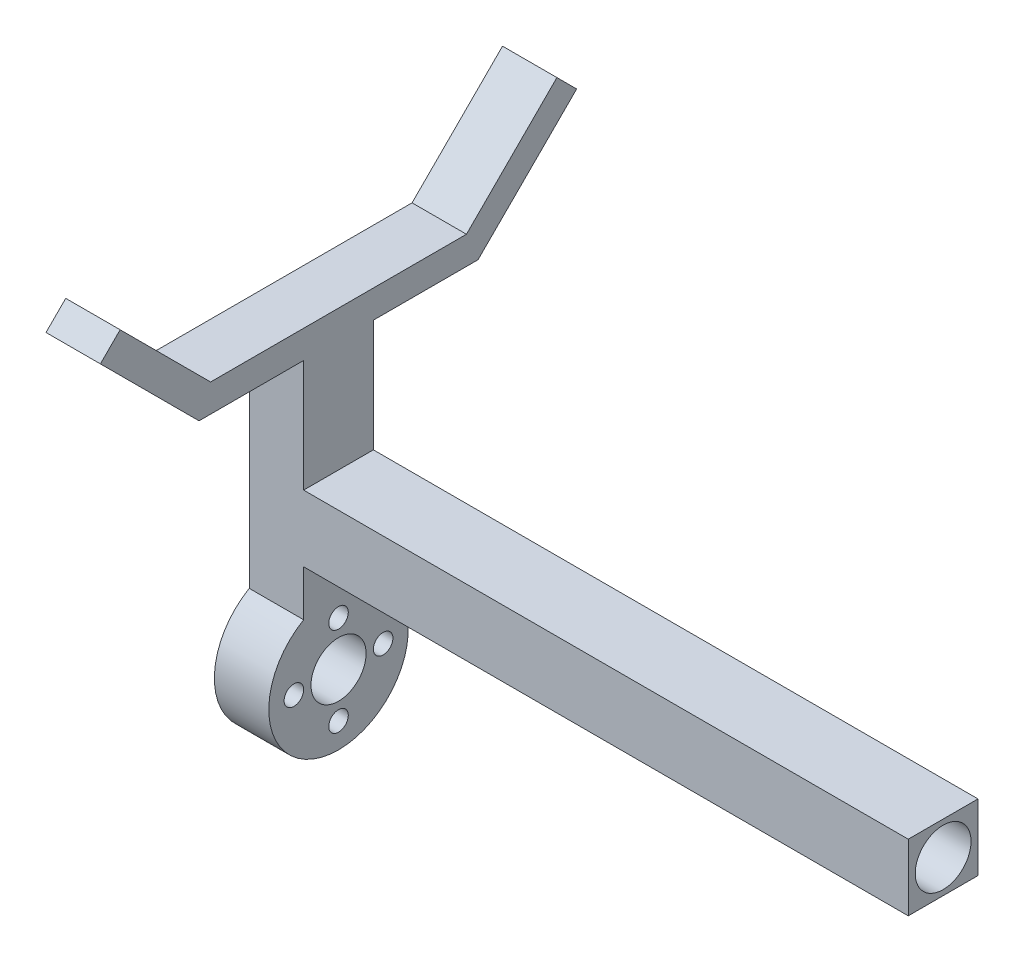
ISO-10303-21;
HEADER;
FILE_DESCRIPTION(('STEP AP214'),'2;1');
FILE_NAME('part.step','',(''),(''),'','','');
FILE_SCHEMA(('AUTOMOTIVE_DESIGN { 1 0 10303 214 1 1 1 1 }'));
ENDSEC;
DATA;
#1=APPLICATION_CONTEXT('core data for automotive mechanical design processes');
#2=APPLICATION_PROTOCOL_DEFINITION('international standard','automotive_design',2000,#1);
#3=PRODUCT_CONTEXT('',#1,'mechanical');
#4=PRODUCT('Part','Part','',(#3));
#5=PRODUCT_RELATED_PRODUCT_CATEGORY('part','',(#4));
#6=PRODUCT_DEFINITION_FORMATION('','',#4);
#7=PRODUCT_DEFINITION_CONTEXT('part definition',#1,'design');
#8=PRODUCT_DEFINITION('design','',#6,#7);
#9=PRODUCT_DEFINITION_SHAPE('','',#8);
#10=(LENGTH_UNIT() NAMED_UNIT(*) SI_UNIT(.MILLI.,.METRE.));
#11=(NAMED_UNIT(*) PLANE_ANGLE_UNIT() SI_UNIT($,.RADIAN.));
#12=(NAMED_UNIT(*) SI_UNIT($,.STERADIAN.) SOLID_ANGLE_UNIT());
#13=UNCERTAINTY_MEASURE_WITH_UNIT(LENGTH_MEASURE(1.E-05),#10,'distance_accuracy_value','');
#14=(GEOMETRIC_REPRESENTATION_CONTEXT(3) GLOBAL_UNCERTAINTY_ASSIGNED_CONTEXT((#13)) GLOBAL_UNIT_ASSIGNED_CONTEXT((#10,
#11,#12)) REPRESENTATION_CONTEXT('',''));
#15=CARTESIAN_POINT('',(0.,0.,0.));
#16=DIRECTION('',(0.,0.,1.));
#17=DIRECTION('',(1.,0.,0.));
#18=AXIS2_PLACEMENT_3D('',#15,#16,#17);
#19=CARTESIAN_POINT('',(9.906,0.,0.));
#20=DIRECTION('',(1.,0.,0.));
#21=DIRECTION('',(0.,0.,-1.));
#22=AXIS2_PLACEMENT_3D('',#19,#20,#21);
#23=PLANE('',#22);
#24=DIRECTION('',(0.,-1.,0.));
#25=VECTOR('',#24,1.);
#26=CARTESIAN_POINT('',(9.906,10.9985226280624,6.35));
#27=LINE('',#26,#25);
#28=CARTESIAN_POINT('',(9.906,51.8925226280624,6.35));
#29=VERTEX_POINT('',#28);
#30=CARTESIAN_POINT('',(9.906,31.4455226280624,6.35));
#31=VERTEX_POINT('',#30);
#32=EDGE_CURVE('E350',#29,#31,#27,.T.);
#33=ORIENTED_EDGE('',*,*,#32,.T.);
#34=DIRECTION('',(0.,0.,-1.));
#35=VECTOR('',#34,1.);
#36=CARTESIAN_POINT('',(9.906,31.4455226280624,-6.35));
#37=LINE('',#36,#35);
#38=CARTESIAN_POINT('',(9.906,31.4455226280624,-6.35));
#39=VERTEX_POINT('',#38);
#40=EDGE_CURVE('E175',#31,#39,#37,.T.);
#41=ORIENTED_EDGE('',*,*,#40,.T.);
#42=DIRECTION('',(0.,1.,0.));
#43=VECTOR('',#42,1.);
#44=CARTESIAN_POINT('',(9.906,10.9985226280624,-6.35));
#45=LINE('',#44,#43);
#46=CARTESIAN_POINT('',(9.906,51.8925226280624,-6.35));
#47=VERTEX_POINT('',#46);
#48=EDGE_CURVE('E95',#39,#47,#45,.T.);
#49=ORIENTED_EDGE('',*,*,#48,.T.);
#50=DIRECTION('',(0.,0.,1.));
#51=VECTOR('',#50,1.);
#52=CARTESIAN_POINT('',(9.906,51.8925226280624,0.));
#53=LINE('',#52,#51);
#54=CARTESIAN_POINT('',(9.906,51.8925226280624,-25.4));
#55=VERTEX_POINT('',#54);
#56=EDGE_CURVE('E233',#55,#47,#53,.T.);
#57=ORIENTED_EDGE('',*,*,#56,.F.);
#58=DIRECTION('',(0.,0.707106781186547,-0.707106781186548));
#59=VECTOR('',#58,1.);
#60=CARTESIAN_POINT('',(9.906,13.2462613140312,13.2462613140312));
#61=LINE('',#60,#59);
#62=CARTESIAN_POINT('',(9.906,69.8530348702006,-43.3605122421383));
#63=VERTEX_POINT('',#62);
#64=EDGE_CURVE('E237',#55,#63,#61,.T.);
#65=ORIENTED_EDGE('',*,*,#64,.T.);
#66=DIRECTION('',(0.,0.707106781186549,0.707106781186546));
#67=VECTOR('',#66,1.);
#68=CARTESIAN_POINT('',(9.906,56.6067735561693,-56.6067735561696));
#69=LINE('',#68,#67);
#70=CARTESIAN_POINT('',(9.906,73.4451373186283,-39.7684097937106));
#71=VERTEX_POINT('',#70);
#72=EDGE_CURVE('E240',#63,#71,#69,.T.);
#73=ORIENTED_EDGE('',*,*,#72,.T.);
#74=DIRECTION('',(0.,-0.707106781186547,0.707106781186548));
#75=VECTOR('',#74,1.);
#76=CARTESIAN_POINT('',(9.906,16.8383637624588,16.8383637624588));
#77=LINE('',#76,#75);
#78=CARTESIAN_POINT('',(9.906,56.9725226280624,-23.2957951031447));
#79=VERTEX_POINT('',#78);
#80=EDGE_CURVE('E243',#71,#79,#77,.T.);
#81=ORIENTED_EDGE('',*,*,#80,.T.);
#82=DIRECTION('',(0.,0.,1.));
#83=VECTOR('',#82,1.);
#84=CARTESIAN_POINT('',(9.906,56.9725226280624,0.));
#85=LINE('',#84,#83);
#86=CARTESIAN_POINT('',(9.906,56.9725226280624,23.2957951031447));
#87=VERTEX_POINT('',#86);
#88=EDGE_CURVE('E246',#79,#87,#85,.T.);
#89=ORIENTED_EDGE('',*,*,#88,.T.);
#90=DIRECTION('',(0.,-0.707106781186548,-0.707106781186548));
#91=VECTOR('',#90,1.);
#92=CARTESIAN_POINT('',(9.906,16.8383637624588,-16.8383637624588));
#93=LINE('',#92,#91);
#94=CARTESIAN_POINT('',(9.906,73.4451373186283,39.7684097937107));
#95=VERTEX_POINT('',#94);
#96=EDGE_CURVE('E219',#95,#87,#93,.T.);
#97=ORIENTED_EDGE('',*,*,#96,.F.);
#98=DIRECTION('',(0.,0.707106781186548,-0.707106781186548));
#99=VECTOR('',#98,1.);
#100=CARTESIAN_POINT('',(9.906,56.6067735561695,56.6067735561695));
#101=LINE('',#100,#99);
#102=CARTESIAN_POINT('',(9.906,69.8530348702007,43.3605122421383));
#103=VERTEX_POINT('',#102);
#104=EDGE_CURVE('E223',#103,#95,#101,.T.);
#105=ORIENTED_EDGE('',*,*,#104,.F.);
#106=DIRECTION('',(0.,0.707106781186548,0.707106781186547));
#107=VECTOR('',#106,1.);
#108=CARTESIAN_POINT('',(9.906,13.2462613140312,-13.2462613140312));
#109=LINE('',#108,#107);
#110=CARTESIAN_POINT('',(9.906,51.8925226280624,25.4));
#111=VERTEX_POINT('',#110);
#112=EDGE_CURVE('E228',#111,#103,#109,.T.);
#113=ORIENTED_EDGE('',*,*,#112,.F.);
#114=EDGE_CURVE('E232',#29,#111,#53,.T.);
#115=ORIENTED_EDGE('',*,*,#114,.F.);
#116=EDGE_LOOP('',(#33,#41,#49,#57,#65,#73,#81,#89,#97,#105,#113,#115));
#117=FACE_BOUND('',#116,.T.);
#118=ADVANCED_FACE('F44',(#117),#23,.T.);
#119=CARTESIAN_POINT('',(9.906,2.33909253381689E-13,-8.128));
#120=DIRECTION('',(1.,0.,0.));
#121=DIRECTION('',(0.,0.,-1.));
#122=AXIS2_PLACEMENT_3D('',#119,#120,#121);
#123=CIRCLE('',#122,1.77800000000001);
#124=CARTESIAN_POINT('',(9.906,2.33909253381689E-13,-9.90600000000001));
#125=VERTEX_POINT('',#124);
#126=EDGE_CURVE('E314',#125,#125,#123,.T.);
#127=ORIENTED_EDGE('',*,*,#126,.F.);
#128=EDGE_LOOP('',(#127));
#129=FACE_BOUND('',#128,.T.);
#130=CARTESIAN_POINT('',(9.906,0.,8.128));
#131=DIRECTION('',(1.,0.,0.));
#132=DIRECTION('',(0.,0.,-1.));
#133=AXIS2_PLACEMENT_3D('',#130,#131,#132);
#134=CIRCLE('',#133,1.77800000000001);
#135=CARTESIAN_POINT('',(9.906,0.,6.34999999999999));
#136=VERTEX_POINT('',#135);
#137=EDGE_CURVE('E330',#136,#136,#134,.T.);
#138=ORIENTED_EDGE('',*,*,#137,.F.);
#139=EDGE_LOOP('',(#138));
#140=FACE_BOUND('',#139,.T.);
#141=CARTESIAN_POINT('',(9.906,0.,0.));
#142=DIRECTION('',(1.,0.,0.));
#143=DIRECTION('',(0.,0.,-1.));
#144=AXIS2_PLACEMENT_3D('',#141,#142,#143);
#145=CIRCLE('',#144,5.0165);
#146=CARTESIAN_POINT('',(9.906,0.,-5.0165));
#147=VERTEX_POINT('',#146);
#148=EDGE_CURVE('E338',#147,#147,#145,.T.);
#149=ORIENTED_EDGE('',*,*,#148,.F.);
#150=EDGE_LOOP('',(#149));
#151=FACE_BOUND('',#150,.T.);
#152=CARTESIAN_POINT('',(9.906,8.12800000000012,1.17452323150018E-13));
#153=DIRECTION('',(1.,0.,0.));
#154=DIRECTION('',(0.,0.,-1.));
#155=AXIS2_PLACEMENT_3D('',#152,#153,#154);
#156=CIRCLE('',#155,1.77800000000001);
#157=CARTESIAN_POINT('',(9.906,8.12800000000012,-1.77799999999989));
#158=VERTEX_POINT('',#157);
#159=EDGE_CURVE('E322',#158,#158,#156,.T.);
#160=ORIENTED_EDGE('',*,*,#159,.F.);
#161=EDGE_LOOP('',(#160));
#162=FACE_BOUND('',#161,.T.);
#163=CARTESIAN_POINT('',(9.906,-8.12799999999988,-1.18447716068365E-13));
#164=DIRECTION('',(1.,0.,0.));
#165=DIRECTION('',(0.,0.,-1.));
#166=AXIS2_PLACEMENT_3D('',#163,#164,#165);
#167=CIRCLE('',#166,1.77800000000001);
#168=CARTESIAN_POINT('',(9.906,-8.12799999999988,-1.77800000000013));
#169=VERTEX_POINT('',#168);
#170=EDGE_CURVE('E306',#169,#169,#167,.T.);
#171=ORIENTED_EDGE('',*,*,#170,.F.);
#172=EDGE_LOOP('',(#171));
#173=FACE_BOUND('',#172,.T.);
#174=CARTESIAN_POINT('',(9.906,10.9985226280624,-6.34999999999999));
#175=VERTEX_POINT('',#174);
#176=CARTESIAN_POINT('',(9.906,19.3544773719376,-6.35));
#177=VERTEX_POINT('',#176);
#178=EDGE_CURVE('E346',#175,#177,#45,.T.);
#179=ORIENTED_EDGE('',*,*,#178,.T.);
#180=DIRECTION('',(0.,0.,1.));
#181=VECTOR('',#180,1.);
#182=CARTESIAN_POINT('',(9.906,19.3544773719376,-6.35));
#183=LINE('',#182,#181);
#184=CARTESIAN_POINT('',(9.906,19.3544773719376,6.35));
#185=VERTEX_POINT('',#184);
#186=EDGE_CURVE('E196',#177,#185,#183,.T.);
#187=ORIENTED_EDGE('',*,*,#186,.T.);
#188=CARTESIAN_POINT('',(9.906,10.9985226280624,6.35));
#189=VERTEX_POINT('',#188);
#190=EDGE_CURVE('E349',#185,#189,#27,.T.);
#191=ORIENTED_EDGE('',*,*,#190,.T.);
#192=CARTESIAN_POINT('',(9.906,0.,0.));
#193=DIRECTION('',(1.,0.,0.));
#194=DIRECTION('',(0.,0.,-1.));
#195=AXIS2_PLACEMENT_3D('',#192,#193,#194);
#196=CIRCLE('',#195,12.7);
#197=EDGE_CURVE('E69',#189,#175,#196,.T.);
#198=ORIENTED_EDGE('',*,*,#197,.T.);
#199=EDGE_LOOP('',(#179,#187,#191,#198));
#200=FACE_BOUND('',#199,.T.);
#201=ADVANCED_FACE('F385',(#129,#140,#151,#162,#173,#200),#23,.T.);
#202=CARTESIAN_POINT('',(0.,0.,0.));
#203=DIRECTION('',(1.,0.,0.));
#204=DIRECTION('',(0.,0.,-1.));
#205=AXIS2_PLACEMENT_3D('',#202,#203,#204);
#206=PLANE('',#205);
#207=DIRECTION('',(0.,1.,0.));
#208=VECTOR('',#207,1.);
#209=CARTESIAN_POINT('',(0.,10.9985226280624,-6.35));
#210=LINE('',#209,#208);
#211=CARTESIAN_POINT('',(0.,10.9985226280624,-6.34999999999999));
#212=VERTEX_POINT('',#211);
#213=CARTESIAN_POINT('',(0.,51.8925226280624,-6.35));
#214=VERTEX_POINT('',#213);
#215=EDGE_CURVE('E342',#212,#214,#210,.T.);
#216=ORIENTED_EDGE('',*,*,#215,.F.);
#217=CARTESIAN_POINT('',(0.,0.,0.));
#218=DIRECTION('',(1.,0.,0.));
#219=DIRECTION('',(0.,0.,-1.));
#220=AXIS2_PLACEMENT_3D('',#217,#218,#219);
#221=CIRCLE('',#220,12.7);
#222=CARTESIAN_POINT('',(0.,10.9985226280624,6.35));
#223=VERTEX_POINT('',#222);
#224=EDGE_CURVE('E87',#223,#212,#221,.T.);
#225=ORIENTED_EDGE('',*,*,#224,.F.);
#226=DIRECTION('',(0.,-1.,0.));
#227=VECTOR('',#226,1.);
#228=CARTESIAN_POINT('',(0.,10.9985226280624,6.35));
#229=LINE('',#228,#227);
#230=CARTESIAN_POINT('',(0.,51.8925226280624,6.35));
#231=VERTEX_POINT('',#230);
#232=EDGE_CURVE('E358',#231,#223,#229,.T.);
#233=ORIENTED_EDGE('',*,*,#232,.F.);
#234=DIRECTION('',(0.,0.,1.));
#235=VECTOR('',#234,1.);
#236=CARTESIAN_POINT('',(0.,51.8925226280624,0.));
#237=LINE('',#236,#235);
#238=CARTESIAN_POINT('',(0.,51.8925226280624,25.4));
#239=VERTEX_POINT('',#238);
#240=EDGE_CURVE('E261',#231,#239,#237,.T.);
#241=ORIENTED_EDGE('',*,*,#240,.T.);
#242=DIRECTION('',(0.,0.707106781186548,0.707106781186547));
#243=VECTOR('',#242,1.);
#244=CARTESIAN_POINT('',(0.,13.2462613140312,-13.2462613140312));
#245=LINE('',#244,#243);
#246=CARTESIAN_POINT('',(0.,69.8530348702007,43.3605122421383));
#247=VERTEX_POINT('',#246);
#248=EDGE_CURVE('E257',#239,#247,#245,.T.);
#249=ORIENTED_EDGE('',*,*,#248,.T.);
#250=DIRECTION('',(0.,0.707106781186548,-0.707106781186548));
#251=VECTOR('',#250,1.);
#252=CARTESIAN_POINT('',(0.,56.6067735561695,56.6067735561695));
#253=LINE('',#252,#251);
#254=CARTESIAN_POINT('',(0.,73.4451373186283,39.7684097937107));
#255=VERTEX_POINT('',#254);
#256=EDGE_CURVE('E253',#247,#255,#253,.T.);
#257=ORIENTED_EDGE('',*,*,#256,.T.);
#258=DIRECTION('',(0.,-0.707106781186548,-0.707106781186548));
#259=VECTOR('',#258,1.);
#260=CARTESIAN_POINT('',(0.,16.8383637624588,-16.8383637624588));
#261=LINE('',#260,#259);
#262=CARTESIAN_POINT('',(0.,56.9725226280624,23.2957951031447));
#263=VERTEX_POINT('',#262);
#264=EDGE_CURVE('E213',#255,#263,#261,.T.);
#265=ORIENTED_EDGE('',*,*,#264,.T.);
#266=DIRECTION('',(0.,0.,1.));
#267=VECTOR('',#266,1.);
#268=CARTESIAN_POINT('',(0.,56.9725226280624,0.));
#269=LINE('',#268,#267);
#270=CARTESIAN_POINT('',(0.,56.9725226280624,-23.2957951031447));
#271=VERTEX_POINT('',#270);
#272=EDGE_CURVE('E224',#271,#263,#269,.T.);
#273=ORIENTED_EDGE('',*,*,#272,.F.);
#274=DIRECTION('',(0.,-0.707106781186547,0.707106781186548));
#275=VECTOR('',#274,1.);
#276=CARTESIAN_POINT('',(0.,16.8383637624588,16.8383637624588));
#277=LINE('',#276,#275);
#278=CARTESIAN_POINT('',(0.,73.4451373186283,-39.7684097937106));
#279=VERTEX_POINT('',#278);
#280=EDGE_CURVE('E272',#279,#271,#277,.T.);
#281=ORIENTED_EDGE('',*,*,#280,.F.);
#282=DIRECTION('',(0.,0.707106781186549,0.707106781186546));
#283=VECTOR('',#282,1.);
#284=CARTESIAN_POINT('',(0.,56.6067735561693,-56.6067735561696));
#285=LINE('',#284,#283);
#286=CARTESIAN_POINT('',(0.,69.8530348702006,-43.3605122421383));
#287=VERTEX_POINT('',#286);
#288=EDGE_CURVE('E269',#287,#279,#285,.T.);
#289=ORIENTED_EDGE('',*,*,#288,.F.);
#290=DIRECTION('',(0.,0.707106781186547,-0.707106781186548));
#291=VECTOR('',#290,1.);
#292=CARTESIAN_POINT('',(0.,13.2462613140312,13.2462613140312));
#293=LINE('',#292,#291);
#294=CARTESIAN_POINT('',(0.,51.8925226280624,-25.4));
#295=VERTEX_POINT('',#294);
#296=EDGE_CURVE('E266',#295,#287,#293,.T.);
#297=ORIENTED_EDGE('',*,*,#296,.F.);
#298=EDGE_CURVE('E262',#295,#214,#237,.T.);
#299=ORIENTED_EDGE('',*,*,#298,.T.);
#300=EDGE_LOOP('',(#216,#225,#233,#241,#249,#257,#265,#273,#281,#289,#297,#299));
#301=FACE_BOUND('',#300,.T.);
#302=CARTESIAN_POINT('',(0.,0.,0.));
#303=DIRECTION('',(1.,0.,0.));
#304=DIRECTION('',(0.,0.,-1.));
#305=AXIS2_PLACEMENT_3D('',#302,#303,#304);
#306=CIRCLE('',#305,5.0165);
#307=CARTESIAN_POINT('',(0.,0.,-5.0165));
#308=VERTEX_POINT('',#307);
#309=EDGE_CURVE('E334',#308,#308,#306,.T.);
#310=ORIENTED_EDGE('',*,*,#309,.T.);
#311=EDGE_LOOP('',(#310));
#312=FACE_BOUND('',#311,.T.);
#313=CARTESIAN_POINT('',(0.,0.,8.128));
#314=DIRECTION('',(1.,0.,0.));
#315=DIRECTION('',(0.,0.,-1.));
#316=AXIS2_PLACEMENT_3D('',#313,#314,#315);
#317=CIRCLE('',#316,1.77800000000001);
#318=CARTESIAN_POINT('',(0.,0.,6.34999999999999));
#319=VERTEX_POINT('',#318);
#320=EDGE_CURVE('E326',#319,#319,#317,.T.);
#321=ORIENTED_EDGE('',*,*,#320,.T.);
#322=EDGE_LOOP('',(#321));
#323=FACE_BOUND('',#322,.T.);
#324=CARTESIAN_POINT('',(0.,8.12800000000012,1.17452323150018E-13));
#325=DIRECTION('',(1.,0.,0.));
#326=DIRECTION('',(0.,0.,-1.));
#327=AXIS2_PLACEMENT_3D('',#324,#325,#326);
#328=CIRCLE('',#327,1.77800000000001);
#329=CARTESIAN_POINT('',(0.,8.12800000000012,-1.77799999999989));
#330=VERTEX_POINT('',#329);
#331=EDGE_CURVE('E318',#330,#330,#328,.T.);
#332=ORIENTED_EDGE('',*,*,#331,.T.);
#333=EDGE_LOOP('',(#332));
#334=FACE_BOUND('',#333,.T.);
#335=CARTESIAN_POINT('',(0.,2.33909253381689E-13,-8.128));
#336=DIRECTION('',(1.,0.,0.));
#337=DIRECTION('',(0.,0.,-1.));
#338=AXIS2_PLACEMENT_3D('',#335,#336,#337);
#339=CIRCLE('',#338,1.77800000000001);
#340=CARTESIAN_POINT('',(0.,2.33909253381689E-13,-9.90600000000001));
#341=VERTEX_POINT('',#340);
#342=EDGE_CURVE('E310',#341,#341,#339,.T.);
#343=ORIENTED_EDGE('',*,*,#342,.T.);
#344=EDGE_LOOP('',(#343));
#345=FACE_BOUND('',#344,.T.);
#346=CARTESIAN_POINT('',(0.,-8.12799999999988,-1.18447716068365E-13));
#347=DIRECTION('',(1.,0.,0.));
#348=DIRECTION('',(0.,0.,-1.));
#349=AXIS2_PLACEMENT_3D('',#346,#347,#348);
#350=CIRCLE('',#349,1.77800000000001);
#351=CARTESIAN_POINT('',(0.,-8.12799999999988,-1.77800000000013));
#352=VERTEX_POINT('',#351);
#353=EDGE_CURVE('E305',#352,#352,#350,.T.);
#354=ORIENTED_EDGE('',*,*,#353,.T.);
#355=EDGE_LOOP('',(#354));
#356=FACE_BOUND('',#355,.T.);
#357=ADVANCED_FACE('F376',(#301,#312,#323,#334,#345,#356),#206,.F.);
#358=CARTESIAN_POINT('',(9.906,10.9985226280624,-6.35));
#359=DIRECTION('',(0.,0.,1.));
#360=DIRECTION('',(1.,0.,0.));
#361=AXIS2_PLACEMENT_3D('',#358,#359,#360);
#362=PLANE('',#361);
#363=ORIENTED_EDGE('',*,*,#215,.T.);
#364=DIRECTION('',(-1.,0.,0.));
#365=VECTOR('',#364,1.);
#366=CARTESIAN_POINT('',(9.906,51.8925226280624,-6.35));
#367=LINE('',#366,#365);
#368=EDGE_CURVE('E11',#47,#214,#367,.T.);
#369=ORIENTED_EDGE('',*,*,#368,.F.);
#370=ORIENTED_EDGE('',*,*,#48,.F.);
#371=DIRECTION('',(-1.,0.,0.));
#372=VECTOR('',#371,1.);
#373=CARTESIAN_POINT('',(120.0000000046,31.4455226280624,-6.35));
#374=LINE('',#373,#372);
#375=CARTESIAN_POINT('',(120.0000000046,31.4455226280624,-6.35));
#376=VERTEX_POINT('',#375);
#377=EDGE_CURVE('E180',#376,#39,#374,.T.);
#378=ORIENTED_EDGE('',*,*,#377,.F.);
#379=DIRECTION('',(0.,-1.,0.));
#380=VECTOR('',#379,1.);
#381=CARTESIAN_POINT('',(120.0000000046,19.3544773719376,-6.35));
#382=LINE('',#381,#380);
#383=CARTESIAN_POINT('',(120.0000000046,19.3544773719376,-6.35));
#384=VERTEX_POINT('',#383);
#385=EDGE_CURVE('E190',#376,#384,#382,.T.);
#386=ORIENTED_EDGE('',*,*,#385,.T.);
#387=DIRECTION('',(-1.,0.,0.));
#388=VECTOR('',#387,1.);
#389=CARTESIAN_POINT('',(120.0000000046,19.3544773719376,-6.35));
#390=LINE('',#389,#388);
#391=EDGE_CURVE('E214',#384,#177,#390,.T.);
#392=ORIENTED_EDGE('',*,*,#391,.T.);
#393=ORIENTED_EDGE('',*,*,#178,.F.);
#394=DIRECTION('',(-1.,0.,0.));
#395=VECTOR('',#394,1.);
#396=CARTESIAN_POINT('',(9.906,10.9985226280624,-6.34999999999999));
#397=LINE('',#396,#395);
#398=EDGE_CURVE('E355',#175,#212,#397,.T.);
#399=ORIENTED_EDGE('',*,*,#398,.T.);
#400=EDGE_LOOP('',(#363,#369,#370,#378,#386,#392,#393,#399));
#401=FACE_BOUND('',#400,.T.);
#402=ADVANCED_FACE('F46',(#401),#362,.F.);
#403=CARTESIAN_POINT('',(9.906,10.9985226280624,6.35));
#404=DIRECTION('',(0.,0.,-1.));
#405=DIRECTION('',(-1.,0.,0.));
#406=AXIS2_PLACEMENT_3D('',#403,#404,#405);
#407=PLANE('',#406);
#408=ORIENTED_EDGE('',*,*,#232,.T.);
#409=DIRECTION('',(-1.,0.,0.));
#410=VECTOR('',#409,1.);
#411=CARTESIAN_POINT('',(9.906,10.9985226280624,6.35));
#412=LINE('',#411,#410);
#413=EDGE_CURVE('E365',#189,#223,#412,.T.);
#414=ORIENTED_EDGE('',*,*,#413,.F.);
#415=ORIENTED_EDGE('',*,*,#190,.F.);
#416=DIRECTION('',(-1.,0.,0.));
#417=VECTOR('',#416,1.);
#418=CARTESIAN_POINT('',(120.0000000046,19.3544773719376,6.35));
#419=LINE('',#418,#417);
#420=CARTESIAN_POINT('',(120.0000000046,19.3544773719376,6.35));
#421=VERTEX_POINT('',#420);
#422=EDGE_CURVE('E60',#421,#185,#419,.T.);
#423=ORIENTED_EDGE('',*,*,#422,.F.);
#424=DIRECTION('',(0.,1.,0.));
#425=VECTOR('',#424,1.);
#426=CARTESIAN_POINT('',(120.0000000046,19.3544773719376,6.35));
#427=LINE('',#426,#425);
#428=CARTESIAN_POINT('',(120.0000000046,31.4455226280624,6.35));
#429=VERTEX_POINT('',#428);
#430=EDGE_CURVE('E188',#421,#429,#427,.T.);
#431=ORIENTED_EDGE('',*,*,#430,.T.);
#432=DIRECTION('',(-1.,0.,0.));
#433=VECTOR('',#432,1.);
#434=CARTESIAN_POINT('',(120.0000000046,31.4455226280624,6.35));
#435=LINE('',#434,#433);
#436=EDGE_CURVE('E171',#429,#31,#435,.T.);
#437=ORIENTED_EDGE('',*,*,#436,.T.);
#438=ORIENTED_EDGE('',*,*,#32,.F.);
#439=DIRECTION('',(-1.,0.,0.));
#440=VECTOR('',#439,1.);
#441=CARTESIAN_POINT('',(9.906,51.8925226280624,6.35));
#442=LINE('',#441,#440);
#443=EDGE_CURVE('E53',#29,#231,#442,.T.);
#444=ORIENTED_EDGE('',*,*,#443,.T.);
#445=EDGE_LOOP('',(#408,#414,#415,#423,#431,#437,#438,#444));
#446=FACE_BOUND('',#445,.T.);
#447=ADVANCED_FACE('F193',(#446),#407,.F.);
#448=CARTESIAN_POINT('',(9.906,0.,0.));
#449=DIRECTION('',(-1.,0.,0.));
#450=DIRECTION('',(0.,0.,1.));
#451=AXIS2_PLACEMENT_3D('',#448,#449,#450);
#452=CYLINDRICAL_SURFACE('',#451,12.7);
#453=ORIENTED_EDGE('',*,*,#224,.T.);
#454=ORIENTED_EDGE('',*,*,#398,.F.);
#455=ORIENTED_EDGE('',*,*,#197,.F.);
#456=ORIENTED_EDGE('',*,*,#413,.T.);
#457=EDGE_LOOP('',(#453,#454,#455,#456));
#458=FACE_BOUND('',#457,.T.);
#459=ADVANCED_FACE('F386',(#458),#452,.T.);
#460=CARTESIAN_POINT('',(9.906,0.,0.));
#461=DIRECTION('',(-1.,0.,0.));
#462=DIRECTION('',(0.,0.,1.));
#463=AXIS2_PLACEMENT_3D('',#460,#461,#462);
#464=CYLINDRICAL_SURFACE('',#463,5.0165);
#465=ORIENTED_EDGE('',*,*,#148,.T.);
#466=EDGE_LOOP('',(#465));
#467=FACE_BOUND('',#466,.T.);
#468=ORIENTED_EDGE('',*,*,#309,.F.);
#469=EDGE_LOOP('',(#468));
#470=FACE_BOUND('',#469,.T.);
#471=ADVANCED_FACE('F410',(#467,#470),#464,.F.);
#472=CARTESIAN_POINT('',(9.906,0.,8.128));
#473=DIRECTION('',(-1.,0.,0.));
#474=DIRECTION('',(0.,0.,1.));
#475=AXIS2_PLACEMENT_3D('',#472,#473,#474);
#476=CYLINDRICAL_SURFACE('',#475,1.77800000000001);
#477=ORIENTED_EDGE('',*,*,#137,.T.);
#478=EDGE_LOOP('',(#477));
#479=FACE_BOUND('',#478,.T.);
#480=ORIENTED_EDGE('',*,*,#320,.F.);
#481=EDGE_LOOP('',(#480));
#482=FACE_BOUND('',#481,.T.);
#483=ADVANCED_FACE('F551',(#479,#482),#476,.F.);
#484=CARTESIAN_POINT('',(9.906,8.12800000000012,1.17452323150018E-13));
#485=DIRECTION('',(-1.,0.,0.));
#486=DIRECTION('',(0.,0.,1.));
#487=AXIS2_PLACEMENT_3D('',#484,#485,#486);
#488=CYLINDRICAL_SURFACE('',#487,1.77800000000001);
#489=ORIENTED_EDGE('',*,*,#159,.T.);
#490=EDGE_LOOP('',(#489));
#491=FACE_BOUND('',#490,.T.);
#492=ORIENTED_EDGE('',*,*,#331,.F.);
#493=EDGE_LOOP('',(#492));
#494=FACE_BOUND('',#493,.T.);
#495=ADVANCED_FACE('F543',(#491,#494),#488,.F.);
#496=CARTESIAN_POINT('',(9.906,2.33909253381689E-13,-8.128));
#497=DIRECTION('',(-1.,0.,0.));
#498=DIRECTION('',(0.,0.,1.));
#499=AXIS2_PLACEMENT_3D('',#496,#497,#498);
#500=CYLINDRICAL_SURFACE('',#499,1.77800000000001);
#501=ORIENTED_EDGE('',*,*,#126,.T.);
#502=EDGE_LOOP('',(#501));
#503=FACE_BOUND('',#502,.T.);
#504=ORIENTED_EDGE('',*,*,#342,.F.);
#505=EDGE_LOOP('',(#504));
#506=FACE_BOUND('',#505,.T.);
#507=ADVANCED_FACE('F535',(#503,#506),#500,.F.);
#508=CARTESIAN_POINT('',(9.906,-8.12799999999988,-1.18447716068365E-13));
#509=DIRECTION('',(-1.,0.,0.));
#510=DIRECTION('',(0.,0.,1.));
#511=AXIS2_PLACEMENT_3D('',#508,#509,#510);
#512=CYLINDRICAL_SURFACE('',#511,1.77800000000001);
#513=ORIENTED_EDGE('',*,*,#170,.T.);
#514=EDGE_LOOP('',(#513));
#515=FACE_BOUND('',#514,.T.);
#516=ORIENTED_EDGE('',*,*,#353,.F.);
#517=EDGE_LOOP('',(#516));
#518=FACE_BOUND('',#517,.T.);
#519=ADVANCED_FACE('F527',(#515,#518),#512,.F.);
#520=CARTESIAN_POINT('',(9.906,51.8925226280624,0.));
#521=DIRECTION('',(0.,-1.,0.));
#522=DIRECTION('',(0.,0.,-1.));
#523=AXIS2_PLACEMENT_3D('',#520,#521,#522);
#524=PLANE('',#523);
#525=ORIENTED_EDGE('',*,*,#443,.F.);
#526=ORIENTED_EDGE('',*,*,#114,.T.);
#527=DIRECTION('',(-1.,0.,0.));
#528=VECTOR('',#527,1.);
#529=CARTESIAN_POINT('',(9.906,51.8925226280624,25.4));
#530=LINE('',#529,#528);
#531=EDGE_CURVE('E295',#111,#239,#530,.T.);
#532=ORIENTED_EDGE('',*,*,#531,.T.);
#533=ORIENTED_EDGE('',*,*,#240,.F.);
#534=EDGE_LOOP('',(#525,#526,#532,#533));
#535=FACE_BOUND('',#534,.T.);
#536=ADVANCED_FACE('F378',(#535),#524,.T.);
#537=CARTESIAN_POINT('',(9.906,16.8383637624588,-16.8383637624588));
#538=DIRECTION('',(0.,0.707106781186548,-0.707106781186548));
#539=DIRECTION('',(0.,0.707106781186548,0.707106781186548));
#540=AXIS2_PLACEMENT_3D('',#537,#538,#539);
#541=PLANE('',#540);
#542=ORIENTED_EDGE('',*,*,#264,.F.);
#543=DIRECTION('',(-1.,0.,0.));
#544=VECTOR('',#543,1.);
#545=CARTESIAN_POINT('',(9.906,73.4451373186283,39.7684097937107));
#546=LINE('',#545,#544);
#547=EDGE_CURVE('E302',#95,#255,#546,.T.);
#548=ORIENTED_EDGE('',*,*,#547,.F.);
#549=ORIENTED_EDGE('',*,*,#96,.T.);
#550=DIRECTION('',(-1.,0.,0.));
#551=VECTOR('',#550,1.);
#552=CARTESIAN_POINT('',(9.906,56.9725226280624,23.2957951031447));
#553=LINE('',#552,#551);
#554=EDGE_CURVE('E249',#87,#263,#553,.T.);
#555=ORIENTED_EDGE('',*,*,#554,.T.);
#556=EDGE_LOOP('',(#542,#548,#549,#555));
#557=FACE_BOUND('',#556,.T.);
#558=ADVANCED_FACE('F508',(#557),#541,.T.);
#559=CARTESIAN_POINT('',(9.906,56.6067735561695,56.6067735561695));
#560=DIRECTION('',(0.,0.707106781186548,0.707106781186548));
#561=DIRECTION('',(0.,-0.707106781186548,0.707106781186548));
#562=AXIS2_PLACEMENT_3D('',#559,#560,#561);
#563=PLANE('',#562);
#564=ORIENTED_EDGE('',*,*,#256,.F.);
#565=DIRECTION('',(-1.,0.,0.));
#566=VECTOR('',#565,1.);
#567=CARTESIAN_POINT('',(9.906,69.8530348702007,43.3605122421383));
#568=LINE('',#567,#566);
#569=EDGE_CURVE('E299',#103,#247,#568,.T.);
#570=ORIENTED_EDGE('',*,*,#569,.F.);
#571=ORIENTED_EDGE('',*,*,#104,.T.);
#572=ORIENTED_EDGE('',*,*,#547,.T.);
#573=EDGE_LOOP('',(#564,#570,#571,#572));
#574=FACE_BOUND('',#573,.T.);
#575=ADVANCED_FACE('F497',(#574),#563,.T.);
#576=CARTESIAN_POINT('',(9.906,13.2462613140312,-13.2462613140312));
#577=DIRECTION('',(0.,-0.707106781186547,0.707106781186548));
#578=DIRECTION('',(0.,-0.707106781186548,-0.707106781186547));
#579=AXIS2_PLACEMENT_3D('',#576,#577,#578);
#580=PLANE('',#579);
#581=ORIENTED_EDGE('',*,*,#248,.F.);
#582=ORIENTED_EDGE('',*,*,#531,.F.);
#583=ORIENTED_EDGE('',*,*,#112,.T.);
#584=ORIENTED_EDGE('',*,*,#569,.T.);
#585=EDGE_LOOP('',(#581,#582,#583,#584));
#586=FACE_BOUND('',#585,.T.);
#587=ADVANCED_FACE('F486',(#586),#580,.T.);
#588=ORIENTED_EDGE('',*,*,#56,.T.);
#589=ORIENTED_EDGE('',*,*,#368,.T.);
#590=ORIENTED_EDGE('',*,*,#298,.F.);
#591=DIRECTION('',(-1.,0.,0.));
#592=VECTOR('',#591,1.);
#593=CARTESIAN_POINT('',(9.906,51.8925226280624,-25.4));
#594=LINE('',#593,#592);
#595=EDGE_CURVE('E292',#55,#295,#594,.T.);
#596=ORIENTED_EDGE('',*,*,#595,.F.);
#597=EDGE_LOOP('',(#588,#589,#590,#596));
#598=FACE_BOUND('',#597,.T.);
#599=ADVANCED_FACE('F475',(#598),#524,.T.);
#600=CARTESIAN_POINT('',(9.906,13.2462613140312,13.2462613140312));
#601=DIRECTION('',(0.,0.707106781186548,0.707106781186547));
#602=DIRECTION('',(0.,-0.707106781186547,0.707106781186548));
#603=AXIS2_PLACEMENT_3D('',#600,#601,#602);
#604=PLANE('',#603);
#605=ORIENTED_EDGE('',*,*,#296,.T.);
#606=DIRECTION('',(-1.,0.,0.));
#607=VECTOR('',#606,1.);
#608=CARTESIAN_POINT('',(9.906,69.8530348702006,-43.3605122421383));
#609=LINE('',#608,#607);
#610=EDGE_CURVE('E288',#63,#287,#609,.T.);
#611=ORIENTED_EDGE('',*,*,#610,.F.);
#612=ORIENTED_EDGE('',*,*,#64,.F.);
#613=ORIENTED_EDGE('',*,*,#595,.T.);
#614=EDGE_LOOP('',(#605,#611,#612,#613));
#615=FACE_BOUND('',#614,.T.);
#616=ADVANCED_FACE('F464',(#615),#604,.F.);
#617=CARTESIAN_POINT('',(9.906,56.6067735561693,-56.6067735561696));
#618=DIRECTION('',(0.,-0.707106781186546,0.707106781186549));
#619=DIRECTION('',(0.,-0.707106781186549,-0.707106781186546));
#620=AXIS2_PLACEMENT_3D('',#617,#618,#619);
#621=PLANE('',#620);
#622=ORIENTED_EDGE('',*,*,#288,.T.);
#623=DIRECTION('',(-1.,0.,0.));
#624=VECTOR('',#623,1.);
#625=CARTESIAN_POINT('',(9.906,73.4451373186283,-39.7684097937106));
#626=LINE('',#625,#624);
#627=EDGE_CURVE('E284',#71,#279,#626,.T.);
#628=ORIENTED_EDGE('',*,*,#627,.F.);
#629=ORIENTED_EDGE('',*,*,#72,.F.);
#630=ORIENTED_EDGE('',*,*,#610,.T.);
#631=EDGE_LOOP('',(#622,#628,#629,#630));
#632=FACE_BOUND('',#631,.T.);
#633=ADVANCED_FACE('F453',(#632),#621,.F.);
#634=CARTESIAN_POINT('',(9.906,16.8383637624588,16.8383637624588));
#635=DIRECTION('',(0.,-0.707106781186548,-0.707106781186547));
#636=DIRECTION('',(0.,0.707106781186547,-0.707106781186548));
#637=AXIS2_PLACEMENT_3D('',#634,#635,#636);
#638=PLANE('',#637);
#639=ORIENTED_EDGE('',*,*,#280,.T.);
#640=DIRECTION('',(-1.,0.,0.));
#641=VECTOR('',#640,1.);
#642=CARTESIAN_POINT('',(9.906,56.9725226280624,-23.2957951031447));
#643=LINE('',#642,#641);
#644=EDGE_CURVE('E280',#79,#271,#643,.T.);
#645=ORIENTED_EDGE('',*,*,#644,.F.);
#646=ORIENTED_EDGE('',*,*,#80,.F.);
#647=ORIENTED_EDGE('',*,*,#627,.T.);
#648=EDGE_LOOP('',(#639,#645,#646,#647));
#649=FACE_BOUND('',#648,.T.);
#650=ADVANCED_FACE('F398',(#649),#638,.F.);
#651=CARTESIAN_POINT('',(9.906,56.9725226280624,0.));
#652=DIRECTION('',(0.,-1.,0.));
#653=DIRECTION('',(0.,0.,-1.));
#654=AXIS2_PLACEMENT_3D('',#651,#652,#653);
#655=PLANE('',#654);
#656=ORIENTED_EDGE('',*,*,#272,.T.);
#657=ORIENTED_EDGE('',*,*,#554,.F.);
#658=ORIENTED_EDGE('',*,*,#88,.F.);
#659=ORIENTED_EDGE('',*,*,#644,.T.);
#660=EDGE_LOOP('',(#656,#657,#658,#659));
#661=FACE_BOUND('',#660,.T.);
#662=ADVANCED_FACE('F391',(#661),#655,.F.);
#663=CARTESIAN_POINT('',(120.0000000046,19.3544773719376,-6.35));
#664=DIRECTION('',(0.,-1.,0.));
#665=DIRECTION('',(0.,0.,-1.));
#666=AXIS2_PLACEMENT_3D('',#663,#664,#665);
#667=PLANE('',#666);
#668=ORIENTED_EDGE('',*,*,#186,.F.);
#669=ORIENTED_EDGE('',*,*,#391,.F.);
#670=DIRECTION('',(0.,0.,1.));
#671=VECTOR('',#670,1.);
#672=CARTESIAN_POINT('',(120.0000000046,19.3544773719376,-6.35));
#673=LINE('',#672,#671);
#674=EDGE_CURVE('E181',#384,#421,#673,.T.);
#675=ORIENTED_EDGE('',*,*,#674,.T.);
#676=ORIENTED_EDGE('',*,*,#422,.T.);
#677=EDGE_LOOP('',(#668,#669,#675,#676));
#678=FACE_BOUND('',#677,.T.);
#679=ADVANCED_FACE('F389',(#678),#667,.T.);
#680=CARTESIAN_POINT('',(120.0000000046,31.4455226280624,-6.35));
#681=DIRECTION('',(0.,1.,0.));
#682=DIRECTION('',(0.,0.,1.));
#683=AXIS2_PLACEMENT_3D('',#680,#681,#682);
#684=PLANE('',#683);
#685=ORIENTED_EDGE('',*,*,#40,.F.);
#686=ORIENTED_EDGE('',*,*,#436,.F.);
#687=DIRECTION('',(0.,0.,-1.));
#688=VECTOR('',#687,1.);
#689=CARTESIAN_POINT('',(120.0000000046,31.4455226280624,-6.35));
#690=LINE('',#689,#688);
#691=EDGE_CURVE('E174',#429,#376,#690,.T.);
#692=ORIENTED_EDGE('',*,*,#691,.T.);
#693=ORIENTED_EDGE('',*,*,#377,.T.);
#694=EDGE_LOOP('',(#685,#686,#692,#693));
#695=FACE_BOUND('',#694,.T.);
#696=ADVANCED_FACE('F173',(#695),#684,.T.);
#697=CARTESIAN_POINT('',(120.0000000046,0.,0.));
#698=DIRECTION('',(1.,0.,0.));
#699=DIRECTION('',(0.,0.,-1.));
#700=AXIS2_PLACEMENT_3D('',#697,#698,#699);
#701=PLANE('',#700);
#702=CARTESIAN_POINT('',(120.0000000046,25.4,0.));
#703=DIRECTION('',(1.,0.,0.));
#704=DIRECTION('',(0.,0.,-1.));
#705=AXIS2_PLACEMENT_3D('',#702,#703,#704);
#706=CIRCLE('',#705,5.08);
#707=CARTESIAN_POINT('',(120.0000000046,25.4,-5.08));
#708=VERTEX_POINT('',#707);
#709=EDGE_CURVE('E201',#708,#708,#706,.T.);
#710=ORIENTED_EDGE('',*,*,#709,.F.);
#711=EDGE_LOOP('',(#710));
#712=FACE_BOUND('',#711,.T.);
#713=ORIENTED_EDGE('',*,*,#430,.F.);
#714=ORIENTED_EDGE('',*,*,#674,.F.);
#715=ORIENTED_EDGE('',*,*,#385,.F.);
#716=ORIENTED_EDGE('',*,*,#691,.F.);
#717=EDGE_LOOP('',(#713,#714,#715,#716));
#718=FACE_BOUND('',#717,.T.);
#719=ADVANCED_FACE('F186',(#712,#718),#701,.T.);
#720=CARTESIAN_POINT('',(107.3000000046,25.4,0.));
#721=DIRECTION('',(1.,0.,0.));
#722=DIRECTION('',(0.,0.,-1.));
#723=AXIS2_PLACEMENT_3D('',#720,#721,#722);
#724=CYLINDRICAL_SURFACE('',#723,5.08);
#725=CARTESIAN_POINT('',(107.3000000046,25.4,0.));
#726=DIRECTION('',(1.,0.,0.));
#727=DIRECTION('',(0.,0.,-1.));
#728=AXIS2_PLACEMENT_3D('',#725,#726,#727);
#729=CIRCLE('',#728,5.08);
#730=CARTESIAN_POINT('',(107.3000000046,25.4,-5.08));
#731=VERTEX_POINT('',#730);
#732=EDGE_CURVE('E209',#731,#731,#729,.T.);
#733=ORIENTED_EDGE('',*,*,#732,.F.);
#734=EDGE_LOOP('',(#733));
#735=FACE_BOUND('',#734,.T.);
#736=ORIENTED_EDGE('',*,*,#709,.T.);
#737=EDGE_LOOP('',(#736));
#738=FACE_BOUND('',#737,.T.);
#739=ADVANCED_FACE('F642',(#735,#738),#724,.F.);
#740=CARTESIAN_POINT('',(107.3000000046,25.4,0.));
#741=DIRECTION('',(1.,0.,0.));
#742=DIRECTION('',(0.,0.,-1.));
#743=AXIS2_PLACEMENT_3D('',#740,#741,#742);
#744=PLANE('',#743);
#745=ORIENTED_EDGE('',*,*,#732,.T.);
#746=EDGE_LOOP('',(#745));
#747=FACE_BOUND('',#746,.T.);
#748=ADVANCED_FACE('F652',(#747),#744,.T.);
#749=CLOSED_SHELL('',(#118,#201,#357,#402,#447,#459,#471,#483,#495,#507,#519,#536,#558,#575,
#587,#599,#616,#633,#650,#662,#679,#696,#719,#739,#748));
#750=MANIFOLD_SOLID_BREP('B2',#749);
#751=ADVANCED_BREP_SHAPE_REPRESENTATION('',(#18,#750),#14);
#752=SHAPE_DEFINITION_REPRESENTATION(#9,#751);
ENDSEC;
END-ISO-10303-21;
